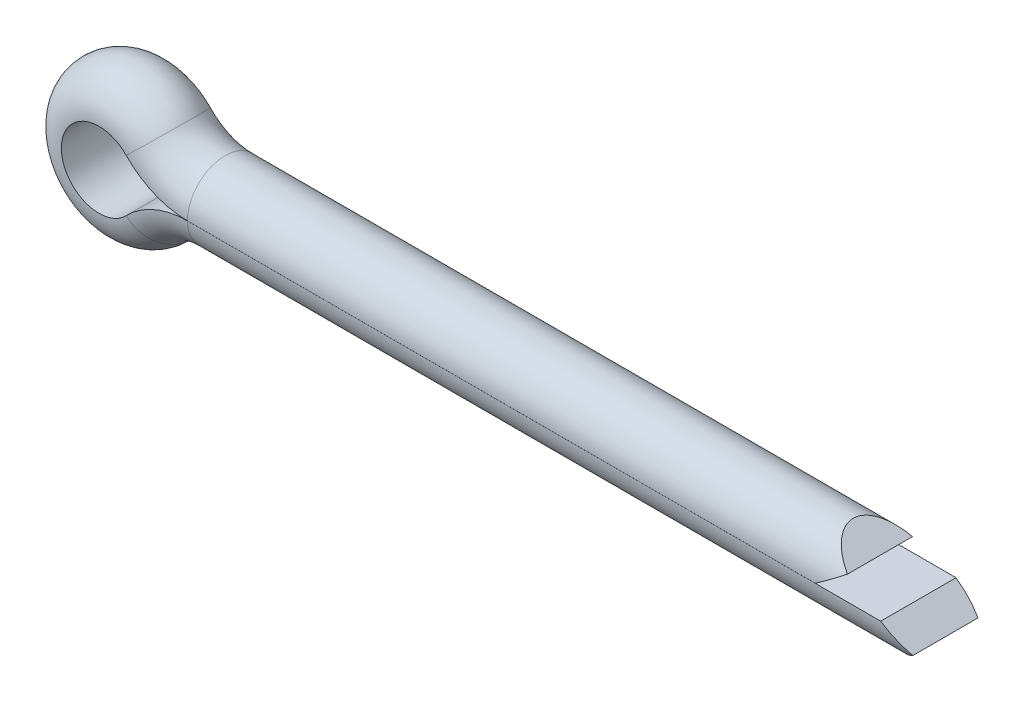
ISO-10303-21;
HEADER;
FILE_DESCRIPTION(('STEP AP214'),'2;1');
FILE_NAME('part.step','',(''),(''),'','','');
FILE_SCHEMA(('AUTOMOTIVE_DESIGN { 1 0 10303 214 1 1 1 1 }'));
ENDSEC;
DATA;
#1=APPLICATION_CONTEXT('core data for automotive mechanical design processes');
#2=APPLICATION_PROTOCOL_DEFINITION('international standard','automotive_design',2000,#1);
#3=PRODUCT_CONTEXT('',#1,'mechanical');
#4=PRODUCT('Part','Part','',(#3));
#5=PRODUCT_RELATED_PRODUCT_CATEGORY('part','',(#4));
#6=PRODUCT_DEFINITION_FORMATION('','',#4);
#7=PRODUCT_DEFINITION_CONTEXT('part definition',#1,'design');
#8=PRODUCT_DEFINITION('design','',#6,#7);
#9=PRODUCT_DEFINITION_SHAPE('','',#8);
#10=(LENGTH_UNIT() NAMED_UNIT(*) SI_UNIT(.MILLI.,.METRE.));
#11=(NAMED_UNIT(*) PLANE_ANGLE_UNIT() SI_UNIT($,.RADIAN.));
#12=(NAMED_UNIT(*) SI_UNIT($,.STERADIAN.) SOLID_ANGLE_UNIT());
#13=UNCERTAINTY_MEASURE_WITH_UNIT(LENGTH_MEASURE(1.E-05),#10,'distance_accuracy_value','');
#14=(GEOMETRIC_REPRESENTATION_CONTEXT(3) GLOBAL_UNCERTAINTY_ASSIGNED_CONTEXT((#13)) GLOBAL_UNIT_ASSIGNED_CONTEXT((#10,
#11,#12)) REPRESENTATION_CONTEXT('',''));
#15=CARTESIAN_POINT('',(0.,0.,0.));
#16=DIRECTION('',(0.,0.,1.));
#17=DIRECTION('',(1.,0.,0.));
#18=AXIS2_PLACEMENT_3D('',#15,#16,#17);
#19=CARTESIAN_POINT('',(0.,-0.00200000000000048,2.29999913043462));
#20=DIRECTION('',(0.,-1.,0.));
#21=DIRECTION('',(1.,0.,0.));
#22=AXIS2_PLACEMENT_3D('',#19,#20,#21);
#23=PLANE('',#22);
#24=DIRECTION('',(1.,0.,0.));
#25=VECTOR('',#24,1.);
#26=CARTESIAN_POINT('',(0.,-0.00200000000000048,2.29999913043462));
#27=LINE('',#26,#25);
#28=CARTESIAN_POINT('',(0.,-0.00200000000000048,2.29999913043462));
#29=VERTEX_POINT('',#28);
#30=CARTESIAN_POINT('',(42.3505593111616,-0.00200000000000027,2.29999913043462));
#31=VERTEX_POINT('',#30);
#32=EDGE_CURVE('E51',#29,#31,#27,.T.);
#33=ORIENTED_EDGE('',*,*,#32,.T.);
#34=DIRECTION('',(0.,0.,-1.));
#35=VECTOR('',#34,1.);
#36=CARTESIAN_POINT('',(42.3505593111616,-0.00200000000000006,2.29999913043462));
#37=LINE('',#36,#35);
#38=CARTESIAN_POINT('',(42.3505593111616,-0.00200000000000027,-2.29999913043462));
#39=VERTEX_POINT('',#38);
#40=EDGE_CURVE('E107',#31,#39,#37,.T.);
#41=ORIENTED_EDGE('',*,*,#40,.T.);
#42=DIRECTION('',(1.,0.,0.));
#43=VECTOR('',#42,1.);
#44=CARTESIAN_POINT('',(0.,-0.00200000000000048,-2.29999913043462));
#45=LINE('',#44,#43);
#46=CARTESIAN_POINT('',(0.,-0.00200000000000048,-2.29999913043462));
#47=VERTEX_POINT('',#46);
#48=EDGE_CURVE('E13',#47,#39,#45,.T.);
#49=ORIENTED_EDGE('',*,*,#48,.F.);
#50=DIRECTION('',(0.,0.,-1.));
#51=VECTOR('',#50,1.);
#52=CARTESIAN_POINT('',(0.,-0.00200000000000048,2.29999913043462));
#53=LINE('',#52,#51);
#54=EDGE_CURVE('E124',#29,#47,#53,.T.);
#55=ORIENTED_EDGE('',*,*,#54,.F.);
#56=EDGE_LOOP('',(#33,#41,#49,#55));
#57=FACE_BOUND('',#56,.T.);
#58=ADVANCED_FACE('F44',(#57),#23,.F.);
#59=CARTESIAN_POINT('',(0.,0.,0.));
#60=DIRECTION('',(1.,0.,0.));
#61=DIRECTION('',(0.,1.,0.));
#62=AXIS2_PLACEMENT_3D('',#59,#60,#61);
#63=CYLINDRICAL_SURFACE('',#62,2.3);
#64=CARTESIAN_POINT('',(45.6353436974954,0.,0.));
#65=DIRECTION('',(-0.57556115597885,0.817758739316364,0.));
#66=DIRECTION('',(0.817758739316365,0.57556115597885,0.));
#67=AXIS2_PLACEMENT_3D('',#64,#65,#66);
#68=ELLIPSE('',#67,3.99610011222599,2.3);
#69=CARTESIAN_POINT('',(44.,-1.15099999999999,-1.99128074364215));
#70=VERTEX_POINT('',#69);
#71=CARTESIAN_POINT('',(44.0000000000001,-1.151,1.99128074364215));
#72=VERTEX_POINT('',#71);
#73=EDGE_CURVE('E121',#70,#72,#68,.T.);
#74=ORIENTED_EDGE('',*,*,#73,.T.);
#75=CARTESIAN_POINT('',(42.3476882220601,0.,0.));
#76=DIRECTION('',(-0.571588343858202,-0.820540532311133,0.));
#77=DIRECTION('',(0.820540532311133,-0.571588343858202,0.));
#78=AXIS2_PLACEMENT_3D('',#75,#76,#77);
#79=ELLIPSE('',#78,4.02387491752382,2.3);
#80=EDGE_CURVE('E110',#72,#31,#79,.T.);
#81=ORIENTED_EDGE('',*,*,#80,.T.);
#82=ORIENTED_EDGE('',*,*,#32,.F.);
#83=CARTESIAN_POINT('',(0.,0.,0.));
#84=DIRECTION('',(-1.,0.,0.));
#85=DIRECTION('',(0.,0.,-1.));
#86=AXIS2_PLACEMENT_3D('',#83,#84,#85);
#87=CIRCLE('',#86,2.3);
#88=EDGE_CURVE('E134',#47,#29,#87,.T.);
#89=ORIENTED_EDGE('',*,*,#88,.F.);
#90=ORIENTED_EDGE('',*,*,#48,.T.);
#91=EDGE_CURVE('E112',#39,#70,#79,.T.);
#92=ORIENTED_EDGE('',*,*,#91,.T.);
#93=EDGE_LOOP('',(#74,#81,#82,#89,#90,#92));
#94=FACE_BOUND('',#93,.T.);
#95=ADVANCED_FACE('F118',(#94),#63,.T.);
#96=CARTESIAN_POINT('',(0.,-5.18913043478261,0.));
#97=DIRECTION('',(0.,0.,-1.));
#98=DIRECTION('',(-1.,0.,0.));
#99=AXIS2_PLACEMENT_3D('',#96,#97,#98);
#100=CYLINDRICAL_SURFACE('',#99,5.18713043478261);
#101=DIRECTION('',(0.,0.,-1.));
#102=VECTOR('',#101,1.);
#103=CARTESIAN_POINT('',(-3.74015442670535,-1.59502873730041,2.29999913043462));
#104=LINE('',#103,#102);
#105=CARTESIAN_POINT('',(-3.74015442670535,-1.59502873730041,2.29999913043462));
#106=VERTEX_POINT('',#105);
#107=CARTESIAN_POINT('',(-3.74015442670535,-1.59502873730041,-2.29999913043462));
#108=VERTEX_POINT('',#107);
#109=EDGE_CURVE('E142',#106,#108,#104,.T.);
#110=ORIENTED_EDGE('',*,*,#109,.F.);
#111=CARTESIAN_POINT('',(0.,-5.18913043478261,2.29999913043462));
#112=DIRECTION('',(0.,0.,-1.));
#113=DIRECTION('',(-1.,0.,0.));
#114=AXIS2_PLACEMENT_3D('',#111,#112,#113);
#115=CIRCLE('',#114,5.18713043478261);
#116=EDGE_CURVE('E128',#106,#29,#115,.T.);
#117=ORIENTED_EDGE('',*,*,#116,.T.);
#118=ORIENTED_EDGE('',*,*,#54,.T.);
#119=CARTESIAN_POINT('',(0.,-5.18913043478261,-2.29999913043462));
#120=DIRECTION('',(0.,0.,-1.));
#121=DIRECTION('',(-1.,0.,0.));
#122=AXIS2_PLACEMENT_3D('',#119,#120,#121);
#123=CIRCLE('',#122,5.18713043478261);
#124=EDGE_CURVE('E126',#108,#47,#123,.T.);
#125=ORIENTED_EDGE('',*,*,#124,.F.);
#126=EDGE_LOOP('',(#110,#117,#118,#125));
#127=FACE_BOUND('',#126,.T.);
#128=ADVANCED_FACE('F207',(#127),#100,.T.);
#129=CARTESIAN_POINT('',(0.,-5.18913043478261,0.));
#130=DIRECTION('',(0.,0.,-1.));
#131=DIRECTION('',(-1.,0.,0.));
#132=AXIS2_PLACEMENT_3D('',#129,#130,#131);
#133=TOROIDAL_SURFACE('',#132,5.18913043478261,2.3);
#134=CARTESIAN_POINT('',(-3.74159651669083,-1.59364296081275,0.));
#135=DIRECTION('',(-0.69288824383163,-0.721044992743116,0.));
#136=DIRECTION('',(0.,0.,-1.));
#137=AXIS2_PLACEMENT_3D('',#134,#135,#136);
#138=CIRCLE('',#137,2.3);
#139=EDGE_CURVE('E145',#108,#106,#138,.T.);
#140=ORIENTED_EDGE('',*,*,#139,.F.);
#141=ORIENTED_EDGE('',*,*,#124,.T.);
#142=ORIENTED_EDGE('',*,*,#88,.T.);
#143=ORIENTED_EDGE('',*,*,#116,.F.);
#144=EDGE_LOOP('',(#140,#141,#142,#143));
#145=FACE_BOUND('',#144,.T.);
#146=ADVANCED_FACE('F209',(#145),#133,.T.);
#147=CARTESIAN_POINT('',(-5.4,0.,0.));
#148=DIRECTION('',(0.,0.,1.));
#149=DIRECTION('',(1.,0.,0.));
#150=AXIS2_PLACEMENT_3D('',#147,#148,#149);
#151=CYLINDRICAL_SURFACE('',#150,2.302);
#152=DIRECTION('',(0.,0.,-1.));
#153=VECTOR('',#152,1.);
#154=CARTESIAN_POINT('',(-3.74015442670537,1.59502873730044,2.29999913043462));
#155=LINE('',#154,#153);
#156=CARTESIAN_POINT('',(-3.74015442670537,1.59502873730044,2.29999913043462));
#157=VERTEX_POINT('',#156);
#158=CARTESIAN_POINT('',(-3.74015442670537,1.59502873730044,-2.29999913043462));
#159=VERTEX_POINT('',#158);
#160=EDGE_CURVE('E154',#157,#159,#155,.T.);
#161=ORIENTED_EDGE('',*,*,#160,.F.);
#162=CARTESIAN_POINT('',(-5.4,0.,2.29999913043462));
#163=DIRECTION('',(0.,0.,1.));
#164=DIRECTION('',(1.,0.,0.));
#165=AXIS2_PLACEMENT_3D('',#162,#163,#164);
#166=CIRCLE('',#165,2.302);
#167=EDGE_CURVE('E139',#157,#106,#166,.T.);
#168=ORIENTED_EDGE('',*,*,#167,.T.);
#169=ORIENTED_EDGE('',*,*,#109,.T.);
#170=CARTESIAN_POINT('',(-5.4,0.,-2.29999913043462));
#171=DIRECTION('',(0.,0.,1.));
#172=DIRECTION('',(1.,0.,0.));
#173=AXIS2_PLACEMENT_3D('',#170,#171,#172);
#174=CIRCLE('',#173,2.302);
#175=EDGE_CURVE('E136',#159,#108,#174,.T.);
#176=ORIENTED_EDGE('',*,*,#175,.F.);
#177=EDGE_LOOP('',(#161,#168,#169,#176));
#178=FACE_BOUND('',#177,.T.);
#179=ADVANCED_FACE('F204',(#178),#151,.F.);
#180=CARTESIAN_POINT('',(-5.4,0.,0.));
#181=DIRECTION('',(0.,0.,1.));
#182=DIRECTION('',(1.,0.,0.));
#183=AXIS2_PLACEMENT_3D('',#180,#181,#182);
#184=DEGENERATE_TOROIDAL_SURFACE('',#183,2.3,2.3,.T.);
#185=CARTESIAN_POINT('',(-3.74159651669086,1.59364296081277,0.));
#186=DIRECTION('',(0.69288824383164,-0.721044992743106,0.));
#187=DIRECTION('',(0.,0.,-1.));
#188=AXIS2_PLACEMENT_3D('',#185,#186,#187);
#189=CIRCLE('',#188,2.3);
#190=EDGE_CURVE('E157',#159,#157,#189,.T.);
#191=ORIENTED_EDGE('',*,*,#190,.F.);
#192=ORIENTED_EDGE('',*,*,#175,.T.);
#193=ORIENTED_EDGE('',*,*,#139,.T.);
#194=ORIENTED_EDGE('',*,*,#167,.F.);
#195=EDGE_LOOP('',(#191,#192,#193,#194));
#196=FACE_BOUND('',#195,.T.);
#197=ADVANCED_FACE('F201',(#196),#184,.T.);
#198=CARTESIAN_POINT('',(0.,5.18913043478261,0.));
#199=DIRECTION('',(0.,0.,-1.));
#200=DIRECTION('',(-1.,0.,0.));
#201=AXIS2_PLACEMENT_3D('',#198,#199,#200);
#202=CYLINDRICAL_SURFACE('',#201,5.18713043478261);
#203=DIRECTION('',(0.,0.,-1.));
#204=VECTOR('',#203,1.);
#205=CARTESIAN_POINT('',(0.,0.002,2.29999913043462));
#206=LINE('',#205,#204);
#207=CARTESIAN_POINT('',(0.,0.002,2.29999913043462));
#208=VERTEX_POINT('',#207);
#209=CARTESIAN_POINT('',(0.,0.002,-2.29999913043462));
#210=VERTEX_POINT('',#209);
#211=EDGE_CURVE('E164',#208,#210,#206,.T.);
#212=ORIENTED_EDGE('',*,*,#211,.F.);
#213=CARTESIAN_POINT('',(0.,5.18913043478261,2.29999913043462));
#214=DIRECTION('',(0.,0.,-1.));
#215=DIRECTION('',(-1.,0.,0.));
#216=AXIS2_PLACEMENT_3D('',#213,#214,#215);
#217=CIRCLE('',#216,5.18713043478261);
#218=EDGE_CURVE('E151',#208,#157,#217,.T.);
#219=ORIENTED_EDGE('',*,*,#218,.T.);
#220=ORIENTED_EDGE('',*,*,#160,.T.);
#221=CARTESIAN_POINT('',(0.,5.18913043478261,-2.29999913043462));
#222=DIRECTION('',(0.,0.,-1.));
#223=DIRECTION('',(-1.,0.,0.));
#224=AXIS2_PLACEMENT_3D('',#221,#222,#223);
#225=CIRCLE('',#224,5.18713043478261);
#226=EDGE_CURVE('E148',#210,#159,#225,.T.);
#227=ORIENTED_EDGE('',*,*,#226,.F.);
#228=EDGE_LOOP('',(#212,#219,#220,#227));
#229=FACE_BOUND('',#228,.T.);
#230=ADVANCED_FACE('F195',(#229),#202,.T.);
#231=CARTESIAN_POINT('',(0.,5.18913043478261,0.));
#232=DIRECTION('',(0.,0.,-1.));
#233=DIRECTION('',(-1.,0.,0.));
#234=AXIS2_PLACEMENT_3D('',#231,#232,#233);
#235=TOROIDAL_SURFACE('',#234,5.18913043478261,2.3);
#236=CARTESIAN_POINT('',(0.,0.,0.));
#237=DIRECTION('',(1.,0.,0.));
#238=DIRECTION('',(0.,0.,-1.));
#239=AXIS2_PLACEMENT_3D('',#236,#237,#238);
#240=CIRCLE('',#239,2.3);
#241=EDGE_CURVE('E169',#210,#208,#240,.T.);
#242=ORIENTED_EDGE('',*,*,#241,.F.);
#243=ORIENTED_EDGE('',*,*,#226,.T.);
#244=ORIENTED_EDGE('',*,*,#190,.T.);
#245=ORIENTED_EDGE('',*,*,#218,.F.);
#246=EDGE_LOOP('',(#242,#243,#244,#245));
#247=FACE_BOUND('',#246,.T.);
#248=ADVANCED_FACE('F198',(#247),#235,.T.);
#249=CARTESIAN_POINT('',(0.,0.,0.));
#250=DIRECTION('',(1.,0.,0.));
#251=DIRECTION('',(0.,0.,-1.));
#252=AXIS2_PLACEMENT_3D('',#249,#250,#251);
#253=CYLINDRICAL_SURFACE('',#252,2.3);
#254=CARTESIAN_POINT('',(38.34768822206,0.,0.));
#255=DIRECTION('',(-0.571588343858204,0.820540532311132,0.));
#256=DIRECTION('',(0.820540532311132,0.571588343858204,0.));
#257=AXIS2_PLACEMENT_3D('',#254,#255,#256);
#258=ELLIPSE('',#257,4.02387491752381,2.3);
#259=CARTESIAN_POINT('',(40.,1.151,1.99128074364214));
#260=VERTEX_POINT('',#259);
#261=CARTESIAN_POINT('',(38.3505593111616,0.002,2.29999913043462));
#262=VERTEX_POINT('',#261);
#263=EDGE_CURVE('E58',#260,#262,#258,.F.);
#264=ORIENTED_EDGE('',*,*,#263,.F.);
#265=CARTESIAN_POINT('',(41.6353436974953,0.,0.));
#266=DIRECTION('',(-0.57556115597885,-0.817758739316364,0.));
#267=DIRECTION('',(0.817758739316364,-0.57556115597885,0.));
#268=AXIS2_PLACEMENT_3D('',#265,#266,#267);
#269=ELLIPSE('',#268,3.99610011222598,2.3);
#270=CARTESIAN_POINT('',(40.,1.151,-1.99128074364214));
#271=VERTEX_POINT('',#270);
#272=EDGE_CURVE('E177',#271,#260,#269,.F.);
#273=ORIENTED_EDGE('',*,*,#272,.F.);
#274=CARTESIAN_POINT('',(38.3505593111616,0.00199999999999818,-2.29999913043462));
#275=VERTEX_POINT('',#274);
#276=EDGE_CURVE('E173',#275,#271,#258,.F.);
#277=ORIENTED_EDGE('',*,*,#276,.F.);
#278=DIRECTION('',(1.,0.,0.));
#279=VECTOR('',#278,1.);
#280=CARTESIAN_POINT('',(0.,0.002,-2.29999913043462));
#281=LINE('',#280,#279);
#282=EDGE_CURVE('E160',#210,#275,#281,.T.);
#283=ORIENTED_EDGE('',*,*,#282,.F.);
#284=ORIENTED_EDGE('',*,*,#241,.T.);
#285=DIRECTION('',(1.,0.,0.));
#286=VECTOR('',#285,1.);
#287=CARTESIAN_POINT('',(0.,0.002,2.29999913043462));
#288=LINE('',#287,#286);
#289=EDGE_CURVE('E161',#208,#262,#288,.T.);
#290=ORIENTED_EDGE('',*,*,#289,.T.);
#291=EDGE_LOOP('',(#264,#273,#277,#283,#284,#290));
#292=FACE_BOUND('',#291,.T.);
#293=ADVANCED_FACE('F187',(#292),#253,.T.);
#294=CARTESIAN_POINT('',(0.,0.002,2.29999913043462));
#295=DIRECTION('',(0.,-1.,0.));
#296=DIRECTION('',(0.,0.,-1.));
#297=AXIS2_PLACEMENT_3D('',#294,#295,#296);
#298=PLANE('',#297);
#299=DIRECTION('',(0.,0.,-1.));
#300=VECTOR('',#299,1.);
#301=CARTESIAN_POINT('',(38.3505593111616,0.002,2.29999913043462));
#302=LINE('',#301,#300);
#303=EDGE_CURVE('E175',#262,#275,#302,.T.);
#304=ORIENTED_EDGE('',*,*,#303,.F.);
#305=ORIENTED_EDGE('',*,*,#289,.F.);
#306=ORIENTED_EDGE('',*,*,#211,.T.);
#307=ORIENTED_EDGE('',*,*,#282,.T.);
#308=EDGE_LOOP('',(#304,#305,#306,#307));
#309=FACE_BOUND('',#308,.T.);
#310=ADVANCED_FACE('F192',(#309),#298,.T.);
#311=CARTESIAN_POINT('',(40.,1.151,-2.29999913043462));
#312=DIRECTION('',(-0.571588343858204,0.820540532311132,0.));
#313=DIRECTION('',(-0.820540532311132,-0.571588343858204,0.));
#314=AXIS2_PLACEMENT_3D('',#311,#312,#313);
#315=PLANE('',#314);
#316=ORIENTED_EDGE('',*,*,#263,.T.);
#317=ORIENTED_EDGE('',*,*,#303,.T.);
#318=ORIENTED_EDGE('',*,*,#276,.T.);
#319=DIRECTION('',(0.,0.,1.));
#320=VECTOR('',#319,1.);
#321=CARTESIAN_POINT('',(40.,1.151,-2.29999913043462));
#322=LINE('',#321,#320);
#323=EDGE_CURVE('E179',#271,#260,#322,.T.);
#324=ORIENTED_EDGE('',*,*,#323,.T.);
#325=EDGE_LOOP('',(#316,#317,#318,#324));
#326=FACE_BOUND('',#325,.T.);
#327=ADVANCED_FACE('F182',(#326),#315,.F.);
#328=CARTESIAN_POINT('',(40.,1.151,-2.29999913043462));
#329=DIRECTION('',(-0.57556115597885,-0.817758739316364,0.));
#330=DIRECTION('',(0.817758739316364,-0.57556115597885,0.));
#331=AXIS2_PLACEMENT_3D('',#328,#329,#330);
#332=PLANE('',#331);
#333=ORIENTED_EDGE('',*,*,#272,.T.);
#334=ORIENTED_EDGE('',*,*,#323,.F.);
#335=EDGE_LOOP('',(#333,#334));
#336=FACE_BOUND('',#335,.T.);
#337=ADVANCED_FACE('F288',(#336),#332,.F.);
#338=CARTESIAN_POINT('',(44.0000000000001,-1.151,-2.29999913043462));
#339=DIRECTION('',(-0.57556115597885,0.817758739316364,0.));
#340=DIRECTION('',(-0.817758739316365,-0.57556115597885,0.));
#341=AXIS2_PLACEMENT_3D('',#338,#339,#340);
#342=PLANE('',#341);
#343=DIRECTION('',(0.,0.,1.));
#344=VECTOR('',#343,1.);
#345=CARTESIAN_POINT('',(44.0000000000001,-1.151,-2.29999913043462));
#346=LINE('',#345,#344);
#347=EDGE_CURVE('E66',#70,#72,#346,.T.);
#348=ORIENTED_EDGE('',*,*,#347,.T.);
#349=ORIENTED_EDGE('',*,*,#73,.F.);
#350=EDGE_LOOP('',(#348,#349));
#351=FACE_BOUND('',#350,.T.);
#352=ADVANCED_FACE('F295',(#351),#342,.F.);
#353=CARTESIAN_POINT('',(44.0000000000001,-1.151,-2.29999913043462));
#354=DIRECTION('',(-0.571588343858202,-0.820540532311133,0.));
#355=DIRECTION('',(0.820540532311133,-0.571588343858202,0.));
#356=AXIS2_PLACEMENT_3D('',#353,#354,#355);
#357=PLANE('',#356);
#358=ORIENTED_EDGE('',*,*,#347,.F.);
#359=ORIENTED_EDGE('',*,*,#91,.F.);
#360=ORIENTED_EDGE('',*,*,#40,.F.);
#361=ORIENTED_EDGE('',*,*,#80,.F.);
#362=EDGE_LOOP('',(#358,#359,#360,#361));
#363=FACE_BOUND('',#362,.T.);
#364=ADVANCED_FACE('F109',(#363),#357,.F.);
#365=CLOSED_SHELL('',(#58,#95,#128,#146,#179,#197,#230,#248,#293,#310,#327,#337,#352,#364));
#366=MANIFOLD_SOLID_BREP('B2',#365);
#367=ADVANCED_BREP_SHAPE_REPRESENTATION('',(#18,#366),#14);
#368=SHAPE_DEFINITION_REPRESENTATION(#9,#367);
ENDSEC;
END-ISO-10303-21;
